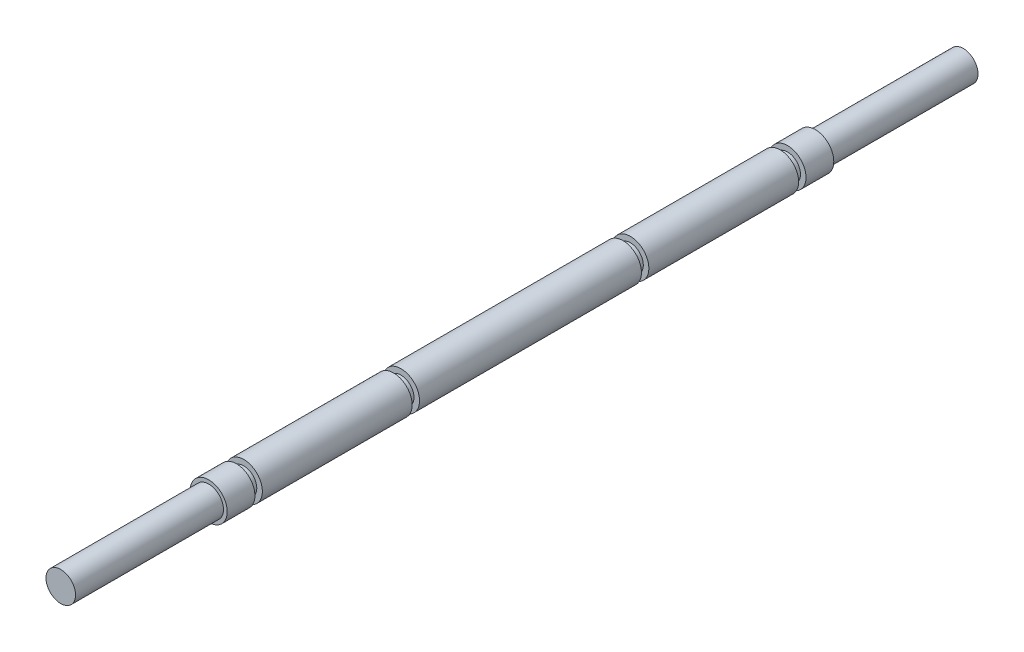
ISO-10303-21;
HEADER;
FILE_DESCRIPTION(('STEP AP214'),'2;1');
FILE_NAME('part.step','',(''),(''),'','','');
FILE_SCHEMA(('AUTOMOTIVE_DESIGN { 1 0 10303 214 1 1 1 1 }'));
ENDSEC;
DATA;
#1=APPLICATION_CONTEXT('core data for automotive mechanical design processes');
#2=APPLICATION_PROTOCOL_DEFINITION('international standard','automotive_design',2000,#1);
#3=PRODUCT_CONTEXT('',#1,'mechanical');
#4=PRODUCT('Part','Part','',(#3));
#5=PRODUCT_RELATED_PRODUCT_CATEGORY('part','',(#4));
#6=PRODUCT_DEFINITION_FORMATION('','',#4);
#7=PRODUCT_DEFINITION_CONTEXT('part definition',#1,'design');
#8=PRODUCT_DEFINITION('design','',#6,#7);
#9=PRODUCT_DEFINITION_SHAPE('','',#8);
#10=(LENGTH_UNIT() NAMED_UNIT(*) SI_UNIT(.MILLI.,.METRE.));
#11=(NAMED_UNIT(*) PLANE_ANGLE_UNIT() SI_UNIT($,.RADIAN.));
#12=(NAMED_UNIT(*) SI_UNIT($,.STERADIAN.) SOLID_ANGLE_UNIT());
#13=UNCERTAINTY_MEASURE_WITH_UNIT(LENGTH_MEASURE(1.E-05),#10,'distance_accuracy_value','');
#14=(GEOMETRIC_REPRESENTATION_CONTEXT(3) GLOBAL_UNCERTAINTY_ASSIGNED_CONTEXT((#13)) GLOBAL_UNIT_ASSIGNED_CONTEXT((#10,
#11,#12)) REPRESENTATION_CONTEXT('',''));
#15=CARTESIAN_POINT('',(0.,0.,0.));
#16=DIRECTION('',(0.,0.,1.));
#17=DIRECTION('',(1.,0.,0.));
#18=AXIS2_PLACEMENT_3D('',#15,#16,#17);
#19=CARTESIAN_POINT('',(0.,0.,152.));
#20=DIRECTION('',(0.,0.,-1.));
#21=DIRECTION('',(-1.,0.,0.));
#22=AXIS2_PLACEMENT_3D('',#19,#20,#21);
#23=CYLINDRICAL_SURFACE('',#22,5.);
#24=CARTESIAN_POINT('',(0.,0.,62.));
#25=DIRECTION('',(0.,0.,1.));
#26=DIRECTION('',(1.,0.,0.));
#27=AXIS2_PLACEMENT_3D('',#24,#25,#26);
#28=CIRCLE('',#27,5.);
#29=CARTESIAN_POINT('',(-5.,0.,62.));
#30=VERTEX_POINT('',#29);
#31=EDGE_CURVE('E119',#30,#30,#28,.T.);
#32=CARTESIAN_POINT('',(0.,0.,102.5));
#33=DIRECTION('',(0.,0.,1.));
#34=DIRECTION('',(1.,0.,0.));
#35=AXIS2_PLACEMENT_3D('',#32,#33,#34);
#36=CIRCLE('',#35,5.);
#37=CARTESIAN_POINT('',(-5.,0.,102.5));
#38=VERTEX_POINT('',#37);
#39=EDGE_CURVE('E199',#38,#38,#36,.T.);
#40=CARTESIAN_POINT('',(-5.,0.,62.));
#41=CARTESIAN_POINT('',(-5.,0.,62.421875));
#42=CARTESIAN_POINT('',(-5.,0.,62.84375));
#43=CARTESIAN_POINT('',(-5.,0.,63.6875));
#44=CARTESIAN_POINT('',(-5.,0.,64.109375));
#45=CARTESIAN_POINT('',(-5.,0.,64.953125));
#46=CARTESIAN_POINT('',(-5.,0.,65.375));
#47=CARTESIAN_POINT('',(-5.,0.,66.21875));
#48=CARTESIAN_POINT('',(-5.,0.,66.640625));
#49=CARTESIAN_POINT('',(-5.,0.,67.484375));
#50=CARTESIAN_POINT('',(-5.,0.,67.90625));
#51=CARTESIAN_POINT('',(-5.,0.,68.75));
#52=CARTESIAN_POINT('',(-5.,0.,69.171875));
#53=CARTESIAN_POINT('',(-5.,0.,70.015625));
#54=CARTESIAN_POINT('',(-5.,0.,70.4375));
#55=CARTESIAN_POINT('',(-5.,0.,71.28125));
#56=CARTESIAN_POINT('',(-5.,0.,71.703125));
#57=CARTESIAN_POINT('',(-5.,0.,72.546875));
#58=CARTESIAN_POINT('',(-5.,0.,72.96875));
#59=CARTESIAN_POINT('',(-5.,0.,73.8125));
#60=CARTESIAN_POINT('',(-5.,0.,74.234375));
#61=CARTESIAN_POINT('',(-5.,0.,75.078125));
#62=CARTESIAN_POINT('',(-5.,0.,75.5));
#63=CARTESIAN_POINT('',(-5.,0.,76.34375));
#64=CARTESIAN_POINT('',(-5.,0.,76.765625));
#65=CARTESIAN_POINT('',(-5.,0.,77.609375));
#66=CARTESIAN_POINT('',(-5.,0.,78.03125));
#67=CARTESIAN_POINT('',(-5.,0.,78.875));
#68=CARTESIAN_POINT('',(-5.,0.,79.296875));
#69=CARTESIAN_POINT('',(-5.,0.,80.140625));
#70=CARTESIAN_POINT('',(-5.,0.,80.5625));
#71=CARTESIAN_POINT('',(-5.,0.,81.40625));
#72=CARTESIAN_POINT('',(-5.,0.,81.828125));
#73=CARTESIAN_POINT('',(-5.,0.,82.671875));
#74=CARTESIAN_POINT('',(-5.,0.,83.09375));
#75=CARTESIAN_POINT('',(-5.,0.,83.9375));
#76=CARTESIAN_POINT('',(-5.,0.,84.359375));
#77=CARTESIAN_POINT('',(-5.,0.,85.203125));
#78=CARTESIAN_POINT('',(-5.,0.,85.625));
#79=CARTESIAN_POINT('',(-5.,0.,86.46875));
#80=CARTESIAN_POINT('',(-5.,0.,86.890625));
#81=CARTESIAN_POINT('',(-5.,0.,87.734375));
#82=CARTESIAN_POINT('',(-5.,0.,88.15625));
#83=CARTESIAN_POINT('',(-5.,0.,89.));
#84=CARTESIAN_POINT('',(-5.,0.,89.421875));
#85=CARTESIAN_POINT('',(-5.,0.,90.265625));
#86=CARTESIAN_POINT('',(-5.,0.,90.6875));
#87=CARTESIAN_POINT('',(-5.,0.,91.53125));
#88=CARTESIAN_POINT('',(-5.,0.,91.953125));
#89=CARTESIAN_POINT('',(-5.,0.,92.796875));
#90=CARTESIAN_POINT('',(-5.,0.,93.21875));
#91=CARTESIAN_POINT('',(-5.,0.,94.0625));
#92=CARTESIAN_POINT('',(-5.,0.,94.484375));
#93=CARTESIAN_POINT('',(-5.,0.,95.328125));
#94=CARTESIAN_POINT('',(-5.,0.,95.75));
#95=CARTESIAN_POINT('',(-5.,0.,96.59375));
#96=CARTESIAN_POINT('',(-5.,0.,97.015625));
#97=CARTESIAN_POINT('',(-5.,0.,97.859375));
#98=CARTESIAN_POINT('',(-5.,0.,98.28125));
#99=CARTESIAN_POINT('',(-5.,0.,99.125));
#100=CARTESIAN_POINT('',(-5.,0.,99.546875));
#101=CARTESIAN_POINT('',(-5.,0.,100.390625));
#102=CARTESIAN_POINT('',(-5.,0.,100.8125));
#103=CARTESIAN_POINT('',(-5.,0.,101.65625));
#104=CARTESIAN_POINT('',(-5.,0.,102.078125));
#105=CARTESIAN_POINT('',(-5.,0.,102.5));
#106=B_SPLINE_CURVE_WITH_KNOTS('',3,(#40,#41,#42,#43,#44,#45,#46,#47,#48,#49,#50,#51,#52,#53,
#54,#55,#56,#57,#58,#59,#60,#61,#62,#63,#64,#65,#66,#67,#68,#69,#70,#71,#72,#73,#74,#75,#76,#77,
#78,#79,#80,#81,#82,#83,#84,#85,#86,#87,#88,#89,#90,#91,#92,#93,#94,#95,#96,#97,#98,#99,#100,
#101,#102,#103,#104,#105),.UNSPECIFIED.,.F.,.F.,(4,2,2,2,2,2,2,2,2,2,2,2,2,2,2,2,2,2,2,2,2,2,2,
2,2,2,2,2,2,2,2,2,4),(0.,1.26562500000001,2.53125,3.79687500000001,5.0625,6.328125,7.59375,
8.859375,10.125,11.390625,12.65625,13.921875,15.1875,16.453125,17.71875,18.984375,20.25,
21.515625,22.78125,24.046875,25.3125,26.578125,27.84375,29.109375,30.375,31.640625,32.90625,
34.171875,35.4375,36.703125,37.96875,39.234375,40.5),.UNSPECIFIED.);
#107=EDGE_CURVE('BSEAM36',#30,#38,#106,.T.);
#108=ORIENTED_EDGE('',*,*,#31,.T.);
#109=ORIENTED_EDGE('',*,*,#39,.F.);
#110=ORIENTED_EDGE('',*,*,#107,.T.);
#111=ORIENTED_EDGE('',*,*,#107,.F.);
#112=EDGE_LOOP('',(#108,#110,#109,#111));
#113=FACE_BOUND('',#112,.T.);
#114=ADVANCED_FACE('F36',(#113),#23,.T.);
#115=CARTESIAN_POINT('',(0.,0.,-92.));
#116=DIRECTION('',(0.,0.,1.));
#117=DIRECTION('',(1.,0.,0.));
#118=AXIS2_PLACEMENT_3D('',#115,#116,#117);
#119=CYLINDRICAL_SURFACE('',#118,5.);
#120=CARTESIAN_POINT('',(0.,0.,-2.));
#121=DIRECTION('',(0.,0.,-1.));
#122=DIRECTION('',(-1.,0.,0.));
#123=AXIS2_PLACEMENT_3D('',#120,#121,#122);
#124=CIRCLE('',#123,5.);
#125=CARTESIAN_POINT('',(5.,0.,-1.99999999999999));
#126=VERTEX_POINT('',#125);
#127=EDGE_CURVE('E124',#126,#126,#124,.T.);
#128=CARTESIAN_POINT('',(0.,0.,-42.5));
#129=DIRECTION('',(0.,0.,-1.));
#130=DIRECTION('',(-1.,0.,0.));
#131=AXIS2_PLACEMENT_3D('',#128,#129,#130);
#132=CIRCLE('',#131,5.);
#133=CARTESIAN_POINT('',(5.,0.,-42.5));
#134=VERTEX_POINT('',#133);
#135=EDGE_CURVE('E182',#134,#134,#132,.T.);
#136=CARTESIAN_POINT('',(5.,0.,-1.99999999999999));
#137=CARTESIAN_POINT('',(5.,0.,-2.42187499999999));
#138=CARTESIAN_POINT('',(5.,0.,-2.84374999999999));
#139=CARTESIAN_POINT('',(5.,0.,-3.68749999999999));
#140=CARTESIAN_POINT('',(5.,0.,-4.10937499999999));
#141=CARTESIAN_POINT('',(5.,0.,-4.95312499999999));
#142=CARTESIAN_POINT('',(5.,0.,-5.37499999999999));
#143=CARTESIAN_POINT('',(5.,0.,-6.21874999999999));
#144=CARTESIAN_POINT('',(5.,0.,-6.64062499999999));
#145=CARTESIAN_POINT('',(5.,0.,-7.48437499999999));
#146=CARTESIAN_POINT('',(5.,0.,-7.90624999999999));
#147=CARTESIAN_POINT('',(5.,0.,-8.74999999999999));
#148=CARTESIAN_POINT('',(5.,0.,-9.17187499999999));
#149=CARTESIAN_POINT('',(5.,0.,-10.015625));
#150=CARTESIAN_POINT('',(5.,0.,-10.4375));
#151=CARTESIAN_POINT('',(5.,0.,-11.28125));
#152=CARTESIAN_POINT('',(5.,0.,-11.703125));
#153=CARTESIAN_POINT('',(5.,0.,-12.546875));
#154=CARTESIAN_POINT('',(5.,0.,-12.96875));
#155=CARTESIAN_POINT('',(5.,0.,-13.8125));
#156=CARTESIAN_POINT('',(5.,0.,-14.234375));
#157=CARTESIAN_POINT('',(5.,0.,-15.078125));
#158=CARTESIAN_POINT('',(5.,0.,-15.5));
#159=CARTESIAN_POINT('',(5.,0.,-16.34375));
#160=CARTESIAN_POINT('',(5.,0.,-16.765625));
#161=CARTESIAN_POINT('',(5.,0.,-17.609375));
#162=CARTESIAN_POINT('',(5.,0.,-18.03125));
#163=CARTESIAN_POINT('',(5.,0.,-18.875));
#164=CARTESIAN_POINT('',(5.,0.,-19.296875));
#165=CARTESIAN_POINT('',(5.,0.,-20.140625));
#166=CARTESIAN_POINT('',(5.,0.,-20.5625));
#167=CARTESIAN_POINT('',(5.,0.,-21.40625));
#168=CARTESIAN_POINT('',(5.,0.,-21.828125));
#169=CARTESIAN_POINT('',(5.,0.,-22.671875));
#170=CARTESIAN_POINT('',(5.,0.,-23.09375));
#171=CARTESIAN_POINT('',(5.,0.,-23.9375));
#172=CARTESIAN_POINT('',(5.,0.,-24.359375));
#173=CARTESIAN_POINT('',(5.,0.,-25.203125));
#174=CARTESIAN_POINT('',(5.,0.,-25.625));
#175=CARTESIAN_POINT('',(5.,0.,-26.46875));
#176=CARTESIAN_POINT('',(5.,0.,-26.890625));
#177=CARTESIAN_POINT('',(5.,0.,-27.734375));
#178=CARTESIAN_POINT('',(5.,0.,-28.15625));
#179=CARTESIAN_POINT('',(5.,0.,-29.));
#180=CARTESIAN_POINT('',(5.,0.,-29.421875));
#181=CARTESIAN_POINT('',(5.,0.,-30.265625));
#182=CARTESIAN_POINT('',(5.,0.,-30.6875));
#183=CARTESIAN_POINT('',(5.,0.,-31.53125));
#184=CARTESIAN_POINT('',(5.,0.,-31.953125));
#185=CARTESIAN_POINT('',(5.,0.,-32.796875));
#186=CARTESIAN_POINT('',(5.,0.,-33.21875));
#187=CARTESIAN_POINT('',(5.,0.,-34.0625));
#188=CARTESIAN_POINT('',(5.,0.,-34.484375));
#189=CARTESIAN_POINT('',(5.,0.,-35.328125));
#190=CARTESIAN_POINT('',(5.,0.,-35.75));
#191=CARTESIAN_POINT('',(5.,0.,-36.59375));
#192=CARTESIAN_POINT('',(5.,0.,-37.015625));
#193=CARTESIAN_POINT('',(5.,0.,-37.859375));
#194=CARTESIAN_POINT('',(5.,0.,-38.28125));
#195=CARTESIAN_POINT('',(5.,0.,-39.125));
#196=CARTESIAN_POINT('',(5.,0.,-39.546875));
#197=CARTESIAN_POINT('',(5.,0.,-40.390625));
#198=CARTESIAN_POINT('',(5.,0.,-40.8125));
#199=CARTESIAN_POINT('',(5.,0.,-41.65625));
#200=CARTESIAN_POINT('',(5.,0.,-42.078125));
#201=CARTESIAN_POINT('',(5.,0.,-42.5));
#202=B_SPLINE_CURVE_WITH_KNOTS('',3,(#136,#137,#138,#139,#140,#141,#142,#143,#144,#145,#146,
#147,#148,#149,#150,#151,#152,#153,#154,#155,#156,#157,#158,#159,#160,#161,#162,#163,#164,#165,
#166,#167,#168,#169,#170,#171,#172,#173,#174,#175,#176,#177,#178,#179,#180,#181,#182,#183,#184,
#185,#186,#187,#188,#189,#190,#191,#192,#193,#194,#195,#196,#197,#198,#199,#200,#201),
.UNSPECIFIED.,.F.,.F.,(4,2,2,2,2,2,2,2,2,2,2,2,2,2,2,2,2,2,2,2,2,2,2,2,2,2,2,2,2,2,2,2,4),(0.,
1.26562500000001,2.53125,3.79687500000001,5.0625,6.328125,7.59375,8.859375,10.125,11.390625,
12.65625,13.921875,15.1875,16.453125,17.71875,18.984375,20.25,21.515625,22.78125,24.046875,
25.3125,26.578125,27.84375,29.109375,30.375,31.640625,32.90625,34.171875,35.4375,36.703125,
37.96875,39.234375,40.5),.UNSPECIFIED.);
#203=EDGE_CURVE('BSEAM84',#126,#134,#202,.T.);
#204=ORIENTED_EDGE('',*,*,#127,.T.);
#205=ORIENTED_EDGE('',*,*,#135,.F.);
#206=ORIENTED_EDGE('',*,*,#203,.T.);
#207=ORIENTED_EDGE('',*,*,#203,.F.);
#208=EDGE_LOOP('',(#204,#206,#205,#207));
#209=FACE_BOUND('',#208,.T.);
#210=ADVANCED_FACE('F84',(#209),#119,.T.);
#211=CARTESIAN_POINT('',(0.,0.,60.));
#212=DIRECTION('',(0.,0.,-1.));
#213=DIRECTION('',(-1.,0.,0.));
#214=AXIS2_PLACEMENT_3D('',#211,#212,#213);
#215=CYLINDRICAL_SURFACE('',#214,5.);
#216=CARTESIAN_POINT('',(0.,0.,60.));
#217=DIRECTION('',(0.,0.,1.));
#218=DIRECTION('',(1.,0.,0.));
#219=AXIS2_PLACEMENT_3D('',#216,#217,#218);
#220=CIRCLE('',#219,5.);
#221=CARTESIAN_POINT('',(5.,0.,60.));
#222=VERTEX_POINT('',#221);
#223=EDGE_CURVE('E51',#222,#222,#220,.T.);
#224=ORIENTED_EDGE('',*,*,#223,.F.);
#225=EDGE_LOOP('',(#224));
#226=FACE_BOUND('',#225,.T.);
#227=CARTESIAN_POINT('',(0.,0.,0.));
#228=DIRECTION('',(0.,0.,1.));
#229=DIRECTION('',(1.,0.,0.));
#230=AXIS2_PLACEMENT_3D('',#227,#228,#229);
#231=CIRCLE('',#230,5.);
#232=CARTESIAN_POINT('',(5.,0.,0.));
#233=VERTEX_POINT('',#232);
#234=EDGE_CURVE('E40',#233,#233,#231,.T.);
#235=ORIENTED_EDGE('',*,*,#234,.T.);
#236=EDGE_LOOP('',(#235));
#237=FACE_BOUND('',#236,.T.);
#238=ADVANCED_FACE('F38',(#226,#237),#215,.T.);
#239=CARTESIAN_POINT('',(0.,0.,60.));
#240=DIRECTION('',(0.,0.,1.));
#241=DIRECTION('',(1.,0.,0.));
#242=AXIS2_PLACEMENT_3D('',#239,#240,#241);
#243=PLANE('',#242);
#244=CARTESIAN_POINT('',(0.,0.,60.));
#245=DIRECTION('',(0.,0.,1.));
#246=DIRECTION('',(1.,0.,0.));
#247=AXIS2_PLACEMENT_3D('',#244,#245,#246);
#248=CIRCLE('',#247,3.5);
#249=CARTESIAN_POINT('',(3.5,0.,60.));
#250=VERTEX_POINT('',#249);
#251=EDGE_CURVE('E45',#250,#250,#248,.T.);
#252=ORIENTED_EDGE('',*,*,#251,.F.);
#253=EDGE_LOOP('',(#252));
#254=FACE_BOUND('',#253,.T.);
#255=ORIENTED_EDGE('',*,*,#223,.T.);
#256=EDGE_LOOP('',(#255));
#257=FACE_BOUND('',#256,.T.);
#258=ADVANCED_FACE('F72',(#254,#257),#243,.T.);
#259=CARTESIAN_POINT('',(0.,0.,0.));
#260=DIRECTION('',(0.,0.,1.));
#261=DIRECTION('',(1.,0.,0.));
#262=AXIS2_PLACEMENT_3D('',#259,#260,#261);
#263=PLANE('',#262);
#264=CARTESIAN_POINT('',(0.,0.,0.));
#265=DIRECTION('',(0.,0.,-1.));
#266=DIRECTION('',(-1.,0.,0.));
#267=AXIS2_PLACEMENT_3D('',#264,#265,#266);
#268=CIRCLE('',#267,3.5);
#269=CARTESIAN_POINT('',(-3.5,0.,0.));
#270=VERTEX_POINT('',#269);
#271=EDGE_CURVE('E10',#270,#270,#268,.T.);
#272=ORIENTED_EDGE('',*,*,#271,.F.);
#273=EDGE_LOOP('',(#272));
#274=FACE_BOUND('',#273,.T.);
#275=ORIENTED_EDGE('',*,*,#234,.F.);
#276=EDGE_LOOP('',(#275));
#277=FACE_BOUND('',#276,.T.);
#278=ADVANCED_FACE('F69',(#274,#277),#263,.F.);
#279=CARTESIAN_POINT('',(0.,0.,62.));
#280=DIRECTION('',(0.,0.,-1.));
#281=DIRECTION('',(-1.,0.,0.));
#282=AXIS2_PLACEMENT_3D('',#279,#280,#281);
#283=CYLINDRICAL_SURFACE('',#282,3.5);
#284=CARTESIAN_POINT('',(0.,0.,62.));
#285=DIRECTION('',(0.,0.,1.));
#286=DIRECTION('',(1.,0.,0.));
#287=AXIS2_PLACEMENT_3D('',#284,#285,#286);
#288=CIRCLE('',#287,3.5);
#289=CARTESIAN_POINT('',(3.5,0.,62.));
#290=VERTEX_POINT('',#289);
#291=EDGE_CURVE('E57',#290,#290,#288,.T.);
#292=ORIENTED_EDGE('',*,*,#291,.F.);
#293=EDGE_LOOP('',(#292));
#294=FACE_BOUND('',#293,.T.);
#295=ORIENTED_EDGE('',*,*,#251,.T.);
#296=EDGE_LOOP('',(#295));
#297=FACE_BOUND('',#296,.T.);
#298=ADVANCED_FACE('F71',(#294,#297),#283,.T.);
#299=CARTESIAN_POINT('',(0.,0.,-2.));
#300=DIRECTION('',(0.,0.,1.));
#301=DIRECTION('',(1.,0.,0.));
#302=AXIS2_PLACEMENT_3D('',#299,#300,#301);
#303=CYLINDRICAL_SURFACE('',#302,3.5);
#304=CARTESIAN_POINT('',(0.,0.,-2.));
#305=DIRECTION('',(0.,0.,-1.));
#306=DIRECTION('',(-1.,0.,0.));
#307=AXIS2_PLACEMENT_3D('',#304,#305,#306);
#308=CIRCLE('',#307,3.5);
#309=CARTESIAN_POINT('',(-3.5,0.,-2.));
#310=VERTEX_POINT('',#309);
#311=EDGE_CURVE('E55',#310,#310,#308,.T.);
#312=ORIENTED_EDGE('',*,*,#311,.F.);
#313=EDGE_LOOP('',(#312));
#314=FACE_BOUND('',#313,.T.);
#315=ORIENTED_EDGE('',*,*,#271,.T.);
#316=EDGE_LOOP('',(#315));
#317=FACE_BOUND('',#316,.T.);
#318=ADVANCED_FACE('F78',(#314,#317),#303,.T.);
#319=CARTESIAN_POINT('',(0.,0.,-2.));
#320=DIRECTION('',(0.,0.,-1.));
#321=DIRECTION('',(-1.,0.,0.));
#322=AXIS2_PLACEMENT_3D('',#319,#320,#321);
#323=PLANE('',#322);
#324=ORIENTED_EDGE('',*,*,#311,.T.);
#325=EDGE_LOOP('',(#324));
#326=FACE_BOUND('',#325,.T.);
#327=ORIENTED_EDGE('',*,*,#127,.F.);
#328=EDGE_LOOP('',(#327));
#329=FACE_BOUND('',#328,.T.);
#330=ADVANCED_FACE('F141',(#326,#329),#323,.F.);
#331=CARTESIAN_POINT('',(0.,0.,62.));
#332=DIRECTION('',(0.,0.,1.));
#333=DIRECTION('',(1.,0.,0.));
#334=AXIS2_PLACEMENT_3D('',#331,#332,#333);
#335=PLANE('',#334);
#336=ORIENTED_EDGE('',*,*,#291,.T.);
#337=EDGE_LOOP('',(#336));
#338=FACE_BOUND('',#337,.T.);
#339=ORIENTED_EDGE('',*,*,#31,.F.);
#340=EDGE_LOOP('',(#339));
#341=FACE_BOUND('',#340,.T.);
#342=ADVANCED_FACE('F149',(#338,#341),#335,.F.);
#343=CARTESIAN_POINT('',(0.,0.,-44.5));
#344=DIRECTION('',(0.,0.,-1.));
#345=DIRECTION('',(-1.,0.,0.));
#346=AXIS2_PLACEMENT_3D('',#343,#344,#345);
#347=PLANE('',#346);
#348=CARTESIAN_POINT('',(0.,0.,-44.5));
#349=DIRECTION('',(0.,0.,-1.));
#350=DIRECTION('',(-1.,0.,0.));
#351=AXIS2_PLACEMENT_3D('',#348,#349,#350);
#352=CIRCLE('',#351,5.);
#353=CARTESIAN_POINT('',(5.,0.,-44.5));
#354=VERTEX_POINT('',#353);
#355=EDGE_CURVE('E176',#354,#354,#352,.T.);
#356=ORIENTED_EDGE('',*,*,#355,.F.);
#357=EDGE_LOOP('',(#356));
#358=FACE_BOUND('',#357,.T.);
#359=CARTESIAN_POINT('',(0.,0.,-44.5));
#360=DIRECTION('',(0.,0.,-1.));
#361=DIRECTION('',(-1.,0.,0.));
#362=AXIS2_PLACEMENT_3D('',#359,#360,#361);
#363=CIRCLE('',#362,3.5);
#364=CARTESIAN_POINT('',(-3.5,0.,-44.5));
#365=VERTEX_POINT('',#364);
#366=EDGE_CURVE('E190',#365,#365,#363,.T.);
#367=ORIENTED_EDGE('',*,*,#366,.T.);
#368=EDGE_LOOP('',(#367));
#369=FACE_BOUND('',#368,.T.);
#370=ADVANCED_FACE('F232',(#358,#369),#347,.F.);
#371=CARTESIAN_POINT('',(0.,0.,-42.5));
#372=DIRECTION('',(0.,0.,-1.));
#373=DIRECTION('',(-1.,0.,0.));
#374=AXIS2_PLACEMENT_3D('',#371,#372,#373);
#375=PLANE('',#374);
#376=ORIENTED_EDGE('',*,*,#135,.T.);
#377=EDGE_LOOP('',(#376));
#378=FACE_BOUND('',#377,.T.);
#379=CARTESIAN_POINT('',(0.,0.,-42.5));
#380=DIRECTION('',(0.,0.,-1.));
#381=DIRECTION('',(-1.,0.,0.));
#382=AXIS2_PLACEMENT_3D('',#379,#380,#381);
#383=CIRCLE('',#382,3.5);
#384=CARTESIAN_POINT('',(-3.5,0.,-42.5));
#385=VERTEX_POINT('',#384);
#386=EDGE_CURVE('E192',#385,#385,#383,.T.);
#387=ORIENTED_EDGE('',*,*,#386,.F.);
#388=EDGE_LOOP('',(#387));
#389=FACE_BOUND('',#388,.T.);
#390=ADVANCED_FACE('F167',(#378,#389),#375,.T.);
#391=CARTESIAN_POINT('',(0.,0.,-44.5));
#392=DIRECTION('',(0.,0.,1.));
#393=DIRECTION('',(1.,0.,0.));
#394=AXIS2_PLACEMENT_3D('',#391,#392,#393);
#395=CYLINDRICAL_SURFACE('',#394,3.5);
#396=ORIENTED_EDGE('',*,*,#366,.F.);
#397=EDGE_LOOP('',(#396));
#398=FACE_BOUND('',#397,.T.);
#399=ORIENTED_EDGE('',*,*,#386,.T.);
#400=EDGE_LOOP('',(#399));
#401=FACE_BOUND('',#400,.T.);
#402=ADVANCED_FACE('F157',(#398,#401),#395,.T.);
#403=CARTESIAN_POINT('',(0.,0.,-92.));
#404=DIRECTION('',(0.,0.,-1.));
#405=DIRECTION('',(-1.,0.,0.));
#406=AXIS2_PLACEMENT_3D('',#403,#404,#405);
#407=PLANE('',#406);
#408=CARTESIAN_POINT('',(0.,0.,-92.));
#409=DIRECTION('',(0.,0.,-1.));
#410=DIRECTION('',(-1.,0.,0.));
#411=AXIS2_PLACEMENT_3D('',#408,#409,#410);
#412=CIRCLE('',#411,4.);
#413=CARTESIAN_POINT('',(-4.,0.,-92.));
#414=VERTEX_POINT('',#413);
#415=EDGE_CURVE('E172',#414,#414,#412,.T.);
#416=ORIENTED_EDGE('',*,*,#415,.T.);
#417=EDGE_LOOP('',(#416));
#418=FACE_BOUND('',#417,.T.);
#419=ADVANCED_FACE('F154',(#418),#407,.T.);
#420=CARTESIAN_POINT('',(0.,0.,-52.));
#421=DIRECTION('',(0.,0.,-1.));
#422=DIRECTION('',(-1.,0.,0.));
#423=AXIS2_PLACEMENT_3D('',#420,#421,#422);
#424=CYLINDRICAL_SURFACE('',#423,4.);
#425=CARTESIAN_POINT('',(0.,0.,-52.));
#426=DIRECTION('',(0.,0.,-1.));
#427=DIRECTION('',(-1.,0.,0.));
#428=AXIS2_PLACEMENT_3D('',#425,#426,#427);
#429=CIRCLE('',#428,4.);
#430=CARTESIAN_POINT('',(-4.,0.,-52.));
#431=VERTEX_POINT('',#430);
#432=EDGE_CURVE('E175',#431,#431,#429,.T.);
#433=ORIENTED_EDGE('',*,*,#432,.T.);
#434=EDGE_LOOP('',(#433));
#435=FACE_BOUND('',#434,.T.);
#436=ORIENTED_EDGE('',*,*,#415,.F.);
#437=EDGE_LOOP('',(#436));
#438=FACE_BOUND('',#437,.T.);
#439=ADVANCED_FACE('F156',(#435,#438),#424,.T.);
#440=CARTESIAN_POINT('',(0.,0.,-52.));
#441=DIRECTION('',(0.,0.,-1.));
#442=DIRECTION('',(-1.,0.,0.));
#443=AXIS2_PLACEMENT_3D('',#440,#441,#442);
#444=PLANE('',#443);
#445=ORIENTED_EDGE('',*,*,#432,.F.);
#446=EDGE_LOOP('',(#445));
#447=FACE_BOUND('',#446,.T.);
#448=CARTESIAN_POINT('',(0.,0.,-52.));
#449=DIRECTION('',(0.,0.,-1.));
#450=DIRECTION('',(-1.,0.,0.));
#451=AXIS2_PLACEMENT_3D('',#448,#449,#450);
#452=CIRCLE('',#451,5.);
#453=CARTESIAN_POINT('',(5.,0.,-52.));
#454=VERTEX_POINT('',#453);
#455=EDGE_CURVE('E133',#454,#454,#452,.T.);
#456=ORIENTED_EDGE('',*,*,#455,.T.);
#457=EDGE_LOOP('',(#456));
#458=FACE_BOUND('',#457,.T.);
#459=ADVANCED_FACE('F152',(#447,#458),#444,.T.);
#460=CARTESIAN_POINT('',(5.,0.,-44.5));
#461=CARTESIAN_POINT('',(5.,0.,-44.578125));
#462=CARTESIAN_POINT('',(5.,0.,-44.65625));
#463=CARTESIAN_POINT('',(5.,0.,-44.8125));
#464=CARTESIAN_POINT('',(5.,0.,-44.890625));
#465=CARTESIAN_POINT('',(5.,0.,-45.046875));
#466=CARTESIAN_POINT('',(5.,0.,-45.125));
#467=CARTESIAN_POINT('',(5.,0.,-45.28125));
#468=CARTESIAN_POINT('',(5.,0.,-45.359375));
#469=CARTESIAN_POINT('',(5.,0.,-45.515625));
#470=CARTESIAN_POINT('',(5.,0.,-45.59375));
#471=CARTESIAN_POINT('',(5.,0.,-45.75));
#472=CARTESIAN_POINT('',(5.,0.,-45.828125));
#473=CARTESIAN_POINT('',(5.,0.,-45.984375));
#474=CARTESIAN_POINT('',(5.,0.,-46.0625));
#475=CARTESIAN_POINT('',(5.,0.,-46.21875));
#476=CARTESIAN_POINT('',(5.,0.,-46.296875));
#477=CARTESIAN_POINT('',(5.,0.,-46.453125));
#478=CARTESIAN_POINT('',(5.,0.,-46.53125));
#479=CARTESIAN_POINT('',(5.,0.,-46.6875));
#480=CARTESIAN_POINT('',(5.,0.,-46.765625));
#481=CARTESIAN_POINT('',(5.,0.,-46.921875));
#482=CARTESIAN_POINT('',(5.,0.,-47.));
#483=CARTESIAN_POINT('',(5.,0.,-47.15625));
#484=CARTESIAN_POINT('',(5.,0.,-47.234375));
#485=CARTESIAN_POINT('',(5.,0.,-47.390625));
#486=CARTESIAN_POINT('',(5.,0.,-47.46875));
#487=CARTESIAN_POINT('',(5.,0.,-47.625));
#488=CARTESIAN_POINT('',(5.,0.,-47.703125));
#489=CARTESIAN_POINT('',(5.,0.,-47.859375));
#490=CARTESIAN_POINT('',(5.,0.,-47.9375));
#491=CARTESIAN_POINT('',(5.,0.,-48.09375));
#492=CARTESIAN_POINT('',(5.,0.,-48.171875));
#493=CARTESIAN_POINT('',(5.,0.,-48.328125));
#494=CARTESIAN_POINT('',(5.,0.,-48.40625));
#495=CARTESIAN_POINT('',(5.,0.,-48.5625));
#496=CARTESIAN_POINT('',(5.,0.,-48.640625));
#497=CARTESIAN_POINT('',(5.,0.,-48.796875));
#498=CARTESIAN_POINT('',(5.,0.,-48.875));
#499=CARTESIAN_POINT('',(5.,0.,-49.03125));
#500=CARTESIAN_POINT('',(5.,0.,-49.109375));
#501=CARTESIAN_POINT('',(5.,0.,-49.265625));
#502=CARTESIAN_POINT('',(5.,0.,-49.34375));
#503=CARTESIAN_POINT('',(5.,0.,-49.5));
#504=CARTESIAN_POINT('',(5.,0.,-49.578125));
#505=CARTESIAN_POINT('',(5.,0.,-49.734375));
#506=CARTESIAN_POINT('',(5.,0.,-49.8125));
#507=CARTESIAN_POINT('',(5.,0.,-49.96875));
#508=CARTESIAN_POINT('',(5.,0.,-50.046875));
#509=CARTESIAN_POINT('',(5.,0.,-50.203125));
#510=CARTESIAN_POINT('',(5.,0.,-50.28125));
#511=CARTESIAN_POINT('',(5.,0.,-50.4375));
#512=CARTESIAN_POINT('',(5.,0.,-50.515625));
#513=CARTESIAN_POINT('',(5.,0.,-50.671875));
#514=CARTESIAN_POINT('',(5.,0.,-50.75));
#515=CARTESIAN_POINT('',(5.,0.,-50.90625));
#516=CARTESIAN_POINT('',(5.,0.,-50.984375));
#517=CARTESIAN_POINT('',(5.,0.,-51.140625));
#518=CARTESIAN_POINT('',(5.,0.,-51.21875));
#519=CARTESIAN_POINT('',(5.,0.,-51.375));
#520=CARTESIAN_POINT('',(5.,0.,-51.453125));
#521=CARTESIAN_POINT('',(5.,0.,-51.609375));
#522=CARTESIAN_POINT('',(5.,0.,-51.6875));
#523=CARTESIAN_POINT('',(5.,0.,-51.84375));
#524=CARTESIAN_POINT('',(5.,0.,-51.921875));
#525=CARTESIAN_POINT('',(5.,0.,-52.));
#526=B_SPLINE_CURVE_WITH_KNOTS('',3,(#460,#461,#462,#463,#464,#465,#466,#467,#468,#469,#470,
#471,#472,#473,#474,#475,#476,#477,#478,#479,#480,#481,#482,#483,#484,#485,#486,#487,#488,#489,
#490,#491,#492,#493,#494,#495,#496,#497,#498,#499,#500,#501,#502,#503,#504,#505,#506,#507,#508,
#509,#510,#511,#512,#513,#514,#515,#516,#517,#518,#519,#520,#521,#522,#523,#524,#525),
.UNSPECIFIED.,.F.,.F.,(4,2,2,2,2,2,2,2,2,2,2,2,2,2,2,2,2,2,2,2,2,2,2,2,2,2,2,2,2,2,2,2,4),(0.,
0.234375000000002,0.468750000000004,0.703124999999999,0.937500000000001,1.171875,1.40625,
1.640625,1.875,2.109375,2.34375000000001,2.578125,2.8125,3.046875,3.28125,3.515625,3.75,
3.98437500000001,4.21875000000001,4.453125,4.6875,4.92187500000001,5.15625,5.390625,
5.62500000000001,5.85937500000001,6.09375000000001,6.328125,6.56250000000001,6.79687500000001,
7.03125,7.265625,7.50000000000001),.UNSPECIFIED.);
#527=EDGE_CURVE('BSEAM95',#354,#454,#526,.T.);
#528=ORIENTED_EDGE('',*,*,#355,.T.);
#529=ORIENTED_EDGE('',*,*,#455,.F.);
#530=ORIENTED_EDGE('',*,*,#527,.T.);
#531=ORIENTED_EDGE('',*,*,#527,.F.);
#532=EDGE_LOOP('',(#528,#530,#529,#531));
#533=FACE_BOUND('',#532,.T.);
#534=ADVANCED_FACE('F95',(#533),#119,.T.);
#535=CARTESIAN_POINT('',(0.,0.,104.5));
#536=DIRECTION('',(0.,0.,1.));
#537=DIRECTION('',(1.,0.,0.));
#538=AXIS2_PLACEMENT_3D('',#535,#536,#537);
#539=PLANE('',#538);
#540=CARTESIAN_POINT('',(0.,0.,104.5));
#541=DIRECTION('',(0.,0.,1.));
#542=DIRECTION('',(1.,0.,0.));
#543=AXIS2_PLACEMENT_3D('',#540,#541,#542);
#544=CIRCLE('',#543,5.);
#545=CARTESIAN_POINT('',(-5.,0.,104.5));
#546=VERTEX_POINT('',#545);
#547=EDGE_CURVE('E113',#546,#546,#544,.T.);
#548=ORIENTED_EDGE('',*,*,#547,.F.);
#549=EDGE_LOOP('',(#548));
#550=FACE_BOUND('',#549,.T.);
#551=CARTESIAN_POINT('',(0.,0.,104.5));
#552=DIRECTION('',(0.,0.,1.));
#553=DIRECTION('',(1.,0.,0.));
#554=AXIS2_PLACEMENT_3D('',#551,#552,#553);
#555=CIRCLE('',#554,3.5);
#556=CARTESIAN_POINT('',(3.5,0.,104.5));
#557=VERTEX_POINT('',#556);
#558=EDGE_CURVE('E203',#557,#557,#555,.T.);
#559=ORIENTED_EDGE('',*,*,#558,.T.);
#560=EDGE_LOOP('',(#559));
#561=FACE_BOUND('',#560,.T.);
#562=ADVANCED_FACE('F151',(#550,#561),#539,.F.);
#563=CARTESIAN_POINT('',(0.,0.,102.5));
#564=DIRECTION('',(0.,0.,1.));
#565=DIRECTION('',(1.,0.,0.));
#566=AXIS2_PLACEMENT_3D('',#563,#564,#565);
#567=PLANE('',#566);
#568=ORIENTED_EDGE('',*,*,#39,.T.);
#569=EDGE_LOOP('',(#568));
#570=FACE_BOUND('',#569,.T.);
#571=CARTESIAN_POINT('',(0.,0.,102.5));
#572=DIRECTION('',(0.,0.,1.));
#573=DIRECTION('',(1.,0.,0.));
#574=AXIS2_PLACEMENT_3D('',#571,#572,#573);
#575=CIRCLE('',#574,3.5);
#576=CARTESIAN_POINT('',(3.5,0.,102.5));
#577=VERTEX_POINT('',#576);
#578=EDGE_CURVE('E206',#577,#577,#575,.T.);
#579=ORIENTED_EDGE('',*,*,#578,.F.);
#580=EDGE_LOOP('',(#579));
#581=FACE_BOUND('',#580,.T.);
#582=ADVANCED_FACE('F219',(#570,#581),#567,.T.);
#583=CARTESIAN_POINT('',(0.,0.,104.5));
#584=DIRECTION('',(0.,0.,-1.));
#585=DIRECTION('',(-1.,0.,0.));
#586=AXIS2_PLACEMENT_3D('',#583,#584,#585);
#587=CYLINDRICAL_SURFACE('',#586,3.5);
#588=ORIENTED_EDGE('',*,*,#558,.F.);
#589=EDGE_LOOP('',(#588));
#590=FACE_BOUND('',#589,.T.);
#591=ORIENTED_EDGE('',*,*,#578,.T.);
#592=EDGE_LOOP('',(#591));
#593=FACE_BOUND('',#592,.T.);
#594=ADVANCED_FACE('F215',(#590,#593),#587,.T.);
#595=CARTESIAN_POINT('',(0.,0.,152.));
#596=DIRECTION('',(0.,0.,1.));
#597=DIRECTION('',(1.,0.,0.));
#598=AXIS2_PLACEMENT_3D('',#595,#596,#597);
#599=PLANE('',#598);
#600=CARTESIAN_POINT('',(0.,0.,152.));
#601=DIRECTION('',(0.,0.,1.));
#602=DIRECTION('',(1.,0.,0.));
#603=AXIS2_PLACEMENT_3D('',#600,#601,#602);
#604=CIRCLE('',#603,4.);
#605=CARTESIAN_POINT('',(4.,0.,152.));
#606=VERTEX_POINT('',#605);
#607=EDGE_CURVE('E127',#606,#606,#604,.T.);
#608=ORIENTED_EDGE('',*,*,#607,.T.);
#609=EDGE_LOOP('',(#608));
#610=FACE_BOUND('',#609,.T.);
#611=ADVANCED_FACE('F218',(#610),#599,.T.);
#612=CARTESIAN_POINT('',(0.,0.,112.));
#613=DIRECTION('',(0.,0.,1.));
#614=DIRECTION('',(1.,0.,0.));
#615=AXIS2_PLACEMENT_3D('',#612,#613,#614);
#616=CYLINDRICAL_SURFACE('',#615,4.);
#617=CARTESIAN_POINT('',(0.,0.,112.));
#618=DIRECTION('',(0.,0.,1.));
#619=DIRECTION('',(1.,0.,0.));
#620=AXIS2_PLACEMENT_3D('',#617,#618,#619);
#621=CIRCLE('',#620,4.);
#622=CARTESIAN_POINT('',(4.,0.,112.));
#623=VERTEX_POINT('',#622);
#624=EDGE_CURVE('E120',#623,#623,#621,.T.);
#625=ORIENTED_EDGE('',*,*,#624,.T.);
#626=EDGE_LOOP('',(#625));
#627=FACE_BOUND('',#626,.T.);
#628=ORIENTED_EDGE('',*,*,#607,.F.);
#629=EDGE_LOOP('',(#628));
#630=FACE_BOUND('',#629,.T.);
#631=ADVANCED_FACE('F107',(#627,#630),#616,.T.);
#632=CARTESIAN_POINT('',(0.,0.,112.));
#633=DIRECTION('',(0.,0.,1.));
#634=DIRECTION('',(1.,0.,0.));
#635=AXIS2_PLACEMENT_3D('',#632,#633,#634);
#636=PLANE('',#635);
#637=ORIENTED_EDGE('',*,*,#624,.F.);
#638=EDGE_LOOP('',(#637));
#639=FACE_BOUND('',#638,.T.);
#640=CARTESIAN_POINT('',(0.,0.,112.));
#641=DIRECTION('',(0.,0.,1.));
#642=DIRECTION('',(1.,0.,0.));
#643=AXIS2_PLACEMENT_3D('',#640,#641,#642);
#644=CIRCLE('',#643,5.);
#645=CARTESIAN_POINT('',(-5.,0.,112.));
#646=VERTEX_POINT('',#645);
#647=EDGE_CURVE('E116',#646,#646,#644,.T.);
#648=ORIENTED_EDGE('',*,*,#647,.T.);
#649=EDGE_LOOP('',(#648));
#650=FACE_BOUND('',#649,.T.);
#651=ADVANCED_FACE('F101',(#639,#650),#636,.T.);
#652=CARTESIAN_POINT('',(-5.,0.,104.5));
#653=CARTESIAN_POINT('',(-5.,0.,104.578125));
#654=CARTESIAN_POINT('',(-5.,0.,104.65625));
#655=CARTESIAN_POINT('',(-5.,0.,104.8125));
#656=CARTESIAN_POINT('',(-5.,0.,104.890625));
#657=CARTESIAN_POINT('',(-5.,0.,105.046875));
#658=CARTESIAN_POINT('',(-5.,0.,105.125));
#659=CARTESIAN_POINT('',(-5.,0.,105.28125));
#660=CARTESIAN_POINT('',(-5.,0.,105.359375));
#661=CARTESIAN_POINT('',(-5.,0.,105.515625));
#662=CARTESIAN_POINT('',(-5.,0.,105.59375));
#663=CARTESIAN_POINT('',(-5.,0.,105.75));
#664=CARTESIAN_POINT('',(-5.,0.,105.828125));
#665=CARTESIAN_POINT('',(-5.,0.,105.984375));
#666=CARTESIAN_POINT('',(-5.,0.,106.0625));
#667=CARTESIAN_POINT('',(-5.,0.,106.21875));
#668=CARTESIAN_POINT('',(-5.,0.,106.296875));
#669=CARTESIAN_POINT('',(-5.,0.,106.453125));
#670=CARTESIAN_POINT('',(-5.,0.,106.53125));
#671=CARTESIAN_POINT('',(-5.,0.,106.6875));
#672=CARTESIAN_POINT('',(-5.,0.,106.765625));
#673=CARTESIAN_POINT('',(-5.,0.,106.921875));
#674=CARTESIAN_POINT('',(-5.,0.,107.));
#675=CARTESIAN_POINT('',(-5.,0.,107.15625));
#676=CARTESIAN_POINT('',(-5.,0.,107.234375));
#677=CARTESIAN_POINT('',(-5.,0.,107.390625));
#678=CARTESIAN_POINT('',(-5.,0.,107.46875));
#679=CARTESIAN_POINT('',(-5.,0.,107.625));
#680=CARTESIAN_POINT('',(-5.,0.,107.703125));
#681=CARTESIAN_POINT('',(-5.,0.,107.859375));
#682=CARTESIAN_POINT('',(-5.,0.,107.9375));
#683=CARTESIAN_POINT('',(-5.,0.,108.09375));
#684=CARTESIAN_POINT('',(-5.,0.,108.171875));
#685=CARTESIAN_POINT('',(-5.,0.,108.328125));
#686=CARTESIAN_POINT('',(-5.,0.,108.40625));
#687=CARTESIAN_POINT('',(-5.,0.,108.5625));
#688=CARTESIAN_POINT('',(-5.,0.,108.640625));
#689=CARTESIAN_POINT('',(-5.,0.,108.796875));
#690=CARTESIAN_POINT('',(-5.,0.,108.875));
#691=CARTESIAN_POINT('',(-5.,0.,109.03125));
#692=CARTESIAN_POINT('',(-5.,0.,109.109375));
#693=CARTESIAN_POINT('',(-5.,0.,109.265625));
#694=CARTESIAN_POINT('',(-5.,0.,109.34375));
#695=CARTESIAN_POINT('',(-5.,0.,109.5));
#696=CARTESIAN_POINT('',(-5.,0.,109.578125));
#697=CARTESIAN_POINT('',(-5.,0.,109.734375));
#698=CARTESIAN_POINT('',(-5.,0.,109.8125));
#699=CARTESIAN_POINT('',(-5.,0.,109.96875));
#700=CARTESIAN_POINT('',(-5.,0.,110.046875));
#701=CARTESIAN_POINT('',(-5.,0.,110.203125));
#702=CARTESIAN_POINT('',(-5.,0.,110.28125));
#703=CARTESIAN_POINT('',(-5.,0.,110.4375));
#704=CARTESIAN_POINT('',(-5.,0.,110.515625));
#705=CARTESIAN_POINT('',(-5.,0.,110.671875));
#706=CARTESIAN_POINT('',(-5.,0.,110.75));
#707=CARTESIAN_POINT('',(-5.,0.,110.90625));
#708=CARTESIAN_POINT('',(-5.,0.,110.984375));
#709=CARTESIAN_POINT('',(-5.,0.,111.140625));
#710=CARTESIAN_POINT('',(-5.,0.,111.21875));
#711=CARTESIAN_POINT('',(-5.,0.,111.375));
#712=CARTESIAN_POINT('',(-5.,0.,111.453125));
#713=CARTESIAN_POINT('',(-5.,0.,111.609375));
#714=CARTESIAN_POINT('',(-5.,0.,111.6875));
#715=CARTESIAN_POINT('',(-5.,0.,111.84375));
#716=CARTESIAN_POINT('',(-5.,0.,111.921875));
#717=CARTESIAN_POINT('',(-5.,0.,112.));
#718=B_SPLINE_CURVE_WITH_KNOTS('',3,(#652,#653,#654,#655,#656,#657,#658,#659,#660,#661,#662,
#663,#664,#665,#666,#667,#668,#669,#670,#671,#672,#673,#674,#675,#676,#677,#678,#679,#680,#681,
#682,#683,#684,#685,#686,#687,#688,#689,#690,#691,#692,#693,#694,#695,#696,#697,#698,#699,#700,
#701,#702,#703,#704,#705,#706,#707,#708,#709,#710,#711,#712,#713,#714,#715,#716,#717),
.UNSPECIFIED.,.F.,.F.,(4,2,2,2,2,2,2,2,2,2,2,2,2,2,2,2,2,2,2,2,2,2,2,2,2,2,2,2,2,2,2,2,4),(0.,
0.234375000000009,0.468750000000004,0.703124999999999,0.937500000000008,1.171875,1.40625,
1.64062500000001,1.87500000000002,2.109375,2.34375000000001,2.57812500000001,2.8125,3.046875,
3.28125000000001,3.51562499999999,3.75,3.98437500000001,4.21874999999999,4.453125,
4.68750000000001,4.92187499999999,5.15625,5.39062500000001,5.62499999999999,5.859375,
6.09375000000001,6.32812499999999,6.5625,6.79687500000001,7.03125,7.265625,7.50000000000001),.UNSPECIFIED.);
#719=EDGE_CURVE('BSEAM87',#546,#646,#718,.T.);
#720=ORIENTED_EDGE('',*,*,#547,.T.);
#721=ORIENTED_EDGE('',*,*,#647,.F.);
#722=ORIENTED_EDGE('',*,*,#719,.T.);
#723=ORIENTED_EDGE('',*,*,#719,.F.);
#724=EDGE_LOOP('',(#720,#722,#721,#723));
#725=FACE_BOUND('',#724,.T.);
#726=ADVANCED_FACE('F87',(#725),#23,.T.);
#727=CLOSED_SHELL('',(#114,#210,#238,#258,#278,#298,#318,#330,#342,#370,#390,#402,#419,#439,
#459,#534,#562,#582,#594,#611,#631,#651,#726));
#728=MANIFOLD_SOLID_BREP('B2',#727);
#729=ADVANCED_BREP_SHAPE_REPRESENTATION('',(#18,#728),#14);
#730=SHAPE_DEFINITION_REPRESENTATION(#9,#729);
ENDSEC;
END-ISO-10303-21;
